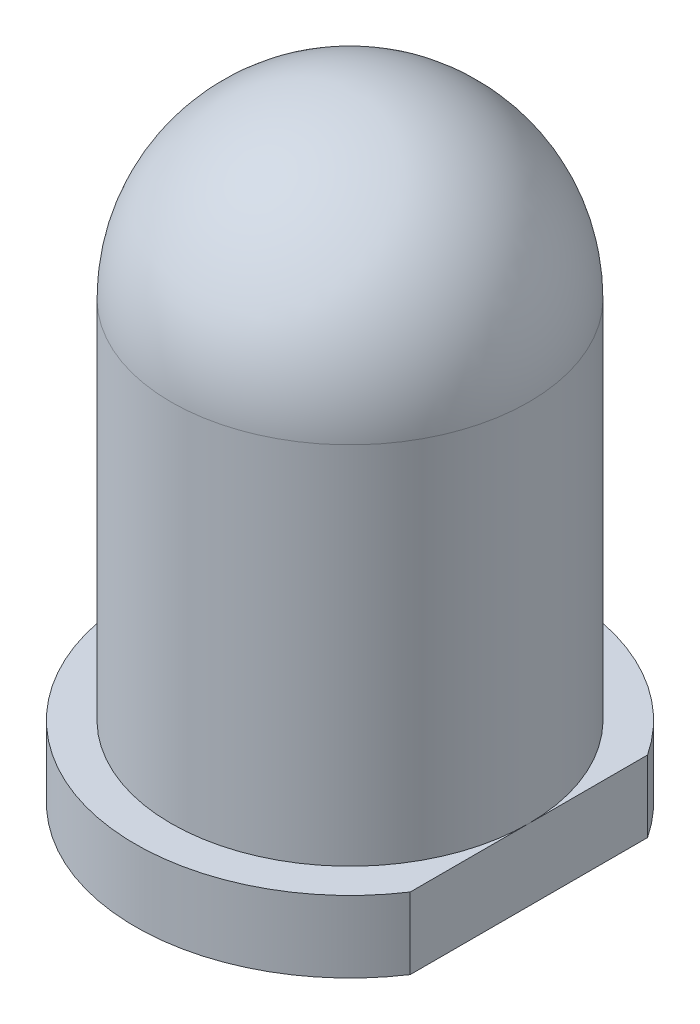
ISO-10303-21;
HEADER;
FILE_DESCRIPTION(('STEP AP214'),'2;1');
FILE_NAME('part.step','',(''),(''),'','','');
FILE_SCHEMA(('AUTOMOTIVE_DESIGN { 1 0 10303 214 1 1 1 1 }'));
ENDSEC;
DATA;
#1=APPLICATION_CONTEXT('core data for automotive mechanical design processes');
#2=APPLICATION_PROTOCOL_DEFINITION('international standard','automotive_design',2000,#1);
#3=PRODUCT_CONTEXT('',#1,'mechanical');
#4=PRODUCT('Part','Part','',(#3));
#5=PRODUCT_RELATED_PRODUCT_CATEGORY('part','',(#4));
#6=PRODUCT_DEFINITION_FORMATION('','',#4);
#7=PRODUCT_DEFINITION_CONTEXT('part definition',#1,'design');
#8=PRODUCT_DEFINITION('design','',#6,#7);
#9=PRODUCT_DEFINITION_SHAPE('','',#8);
#10=(LENGTH_UNIT() NAMED_UNIT(*) SI_UNIT(.MILLI.,.METRE.));
#11=(NAMED_UNIT(*) PLANE_ANGLE_UNIT() SI_UNIT($,.RADIAN.));
#12=(NAMED_UNIT(*) SI_UNIT($,.STERADIAN.) SOLID_ANGLE_UNIT());
#13=UNCERTAINTY_MEASURE_WITH_UNIT(LENGTH_MEASURE(1.E-05),#10,'distance_accuracy_value','');
#14=(GEOMETRIC_REPRESENTATION_CONTEXT(3) GLOBAL_UNCERTAINTY_ASSIGNED_CONTEXT((#13)) GLOBAL_UNIT_ASSIGNED_CONTEXT((#10,
#11,#12)) REPRESENTATION_CONTEXT('',''));
#15=CARTESIAN_POINT('',(0.,0.,0.));
#16=DIRECTION('',(0.,0.,1.));
#17=DIRECTION('',(1.,0.,0.));
#18=AXIS2_PLACEMENT_3D('',#15,#16,#17);
#19=CARTESIAN_POINT('',(0.,1.,0.));
#20=DIRECTION('',(0.,-1.,0.));
#21=DIRECTION('',(0.,0.,-1.));
#22=AXIS2_PLACEMENT_3D('',#19,#20,#21);
#23=CYLINDRICAL_SURFACE('',#22,3.);
#24=CARTESIAN_POINT('',(0.,0.,0.));
#25=DIRECTION('',(0.,-1.,0.));
#26=DIRECTION('',(0.,0.,-1.));
#27=AXIS2_PLACEMENT_3D('',#24,#25,#26);
#28=CIRCLE('',#27,3.);
#29=CARTESIAN_POINT('',(2.5,0.,1.6583123951777));
#30=VERTEX_POINT('',#29);
#31=CARTESIAN_POINT('',(2.5,0.,-1.6583123951777));
#32=VERTEX_POINT('',#31);
#33=EDGE_CURVE('E72',#30,#32,#28,.T.);
#34=ORIENTED_EDGE('',*,*,#33,.F.);
#35=DIRECTION('',(0.,-1.,0.));
#36=VECTOR('',#35,1.);
#37=CARTESIAN_POINT('',(2.5,8.6,1.6583123951777));
#38=LINE('',#37,#36);
#39=CARTESIAN_POINT('',(2.5,1.,1.6583123951777));
#40=VERTEX_POINT('',#39);
#41=EDGE_CURVE('E49',#40,#30,#38,.T.);
#42=ORIENTED_EDGE('',*,*,#41,.F.);
#43=CARTESIAN_POINT('',(0.,1.,0.));
#44=DIRECTION('',(0.,-1.,0.));
#45=DIRECTION('',(0.,0.,-1.));
#46=AXIS2_PLACEMENT_3D('',#43,#44,#45);
#47=CIRCLE('',#46,3.);
#48=CARTESIAN_POINT('',(2.5,1.,-1.6583123951777));
#49=VERTEX_POINT('',#48);
#50=EDGE_CURVE('E74',#40,#49,#47,.T.);
#51=ORIENTED_EDGE('',*,*,#50,.T.);
#52=DIRECTION('',(0.,-1.,0.));
#53=VECTOR('',#52,1.);
#54=CARTESIAN_POINT('',(2.5,8.6,-1.6583123951777));
#55=LINE('',#54,#53);
#56=EDGE_CURVE('E65',#49,#32,#55,.T.);
#57=ORIENTED_EDGE('',*,*,#56,.T.);
#58=EDGE_LOOP('',(#34,#42,#51,#57));
#59=FACE_BOUND('',#58,.T.);
#60=ADVANCED_FACE('F34',(#59),#23,.T.);
#61=CARTESIAN_POINT('',(0.,1.,0.));
#62=DIRECTION('',(0.,-1.,0.));
#63=DIRECTION('',(0.,0.,-1.));
#64=AXIS2_PLACEMENT_3D('',#61,#62,#63);
#65=PLANE('',#64);
#66=DIRECTION('',(0.,0.,1.));
#67=VECTOR('',#66,1.);
#68=CARTESIAN_POINT('',(2.5,1.,0.));
#69=LINE('',#68,#67);
#70=CARTESIAN_POINT('',(2.5,1.,0.));
#71=VERTEX_POINT('',#70);
#72=EDGE_CURVE('E55',#49,#71,#69,.T.);
#73=ORIENTED_EDGE('',*,*,#72,.F.);
#74=ORIENTED_EDGE('',*,*,#50,.F.);
#75=EDGE_CURVE('E78',#71,#40,#69,.T.);
#76=ORIENTED_EDGE('',*,*,#75,.F.);
#77=CARTESIAN_POINT('',(0.,1.,0.));
#78=DIRECTION('',(0.,-1.,0.));
#79=DIRECTION('',(0.,0.,-1.));
#80=AXIS2_PLACEMENT_3D('',#77,#78,#79);
#81=CIRCLE('',#80,2.5);
#82=EDGE_CURVE('E38',#71,#71,#81,.F.);
#83=ORIENTED_EDGE('',*,*,#82,.F.);
#84=EDGE_LOOP('',(#73,#74,#76,#83));
#85=FACE_BOUND('',#84,.T.);
#86=ADVANCED_FACE('F84',(#85),#65,.F.);
#87=CARTESIAN_POINT('',(-2.5,0.,0.));
#88=DIRECTION('',(0.,-1.,0.));
#89=DIRECTION('',(0.,0.,-1.));
#90=AXIS2_PLACEMENT_3D('',#87,#88,#89);
#91=PLANE('',#90);
#92=ORIENTED_EDGE('',*,*,#33,.T.);
#93=DIRECTION('',(0.,0.,1.));
#94=VECTOR('',#93,1.);
#95=CARTESIAN_POINT('',(2.5,0.,0.));
#96=LINE('',#95,#94);
#97=EDGE_CURVE('E62',#32,#30,#96,.T.);
#98=ORIENTED_EDGE('',*,*,#97,.T.);
#99=EDGE_LOOP('',(#92,#98));
#100=FACE_BOUND('',#99,.T.);
#101=ADVANCED_FACE('F36',(#100),#91,.T.);
#102=CARTESIAN_POINT('',(0.,0.,0.));
#103=DIRECTION('',(0.,1.,0.));
#104=DIRECTION('',(0.,0.,1.));
#105=AXIS2_PLACEMENT_3D('',#102,#103,#104);
#106=CYLINDRICAL_SURFACE('',#105,2.5);
#107=ORIENTED_EDGE('',*,*,#82,.T.);
#108=EDGE_LOOP('',(#107));
#109=FACE_BOUND('',#108,.T.);
#110=CARTESIAN_POINT('',(0.,6.1,0.));
#111=DIRECTION('',(0.,1.,0.));
#112=DIRECTION('',(0.,0.,1.));
#113=AXIS2_PLACEMENT_3D('',#110,#111,#112);
#114=CIRCLE('',#113,2.5);
#115=CARTESIAN_POINT('',(0.,6.1,2.5));
#116=VERTEX_POINT('',#115);
#117=EDGE_CURVE('E11',#116,#116,#114,.T.);
#118=ORIENTED_EDGE('',*,*,#117,.F.);
#119=EDGE_LOOP('',(#118));
#120=FACE_BOUND('',#119,.T.);
#121=ADVANCED_FACE('F86',(#109,#120),#106,.T.);
#122=CARTESIAN_POINT('',(0.,6.1,0.));
#123=DIRECTION('',(0.,1.,0.));
#124=DIRECTION('',(1.,0.,0.));
#125=AXIS2_PLACEMENT_3D('',#122,#123,#124);
#126=SPHERICAL_SURFACE('',#125,2.5);
#127=ORIENTED_EDGE('',*,*,#117,.T.);
#128=EDGE_LOOP('',(#127));
#129=FACE_BOUND('',#128,.T.);
#130=ADVANCED_FACE('F89',(#129),#126,.T.);
#131=CARTESIAN_POINT('',(2.5,8.6,0.));
#132=DIRECTION('',(1.,0.,0.));
#133=DIRECTION('',(0.,0.,-1.));
#134=AXIS2_PLACEMENT_3D('',#131,#132,#133);
#135=PLANE('',#134);
#136=ORIENTED_EDGE('',*,*,#72,.T.);
#137=ORIENTED_EDGE('',*,*,#75,.T.);
#138=ORIENTED_EDGE('',*,*,#41,.T.);
#139=ORIENTED_EDGE('',*,*,#97,.F.);
#140=ORIENTED_EDGE('',*,*,#56,.F.);
#141=EDGE_LOOP('',(#136,#137,#138,#139,#140));
#142=FACE_BOUND('',#141,.T.);
#143=ADVANCED_FACE('F64',(#142),#135,.T.);
#144=CLOSED_SHELL('',(#60,#86,#101,#121,#130,#143));
#145=MANIFOLD_SOLID_BREP('B2',#144);
#146=ADVANCED_BREP_SHAPE_REPRESENTATION('',(#18,#145),#14);
#147=SHAPE_DEFINITION_REPRESENTATION(#9,#146);
ENDSEC;
END-ISO-10303-21;
